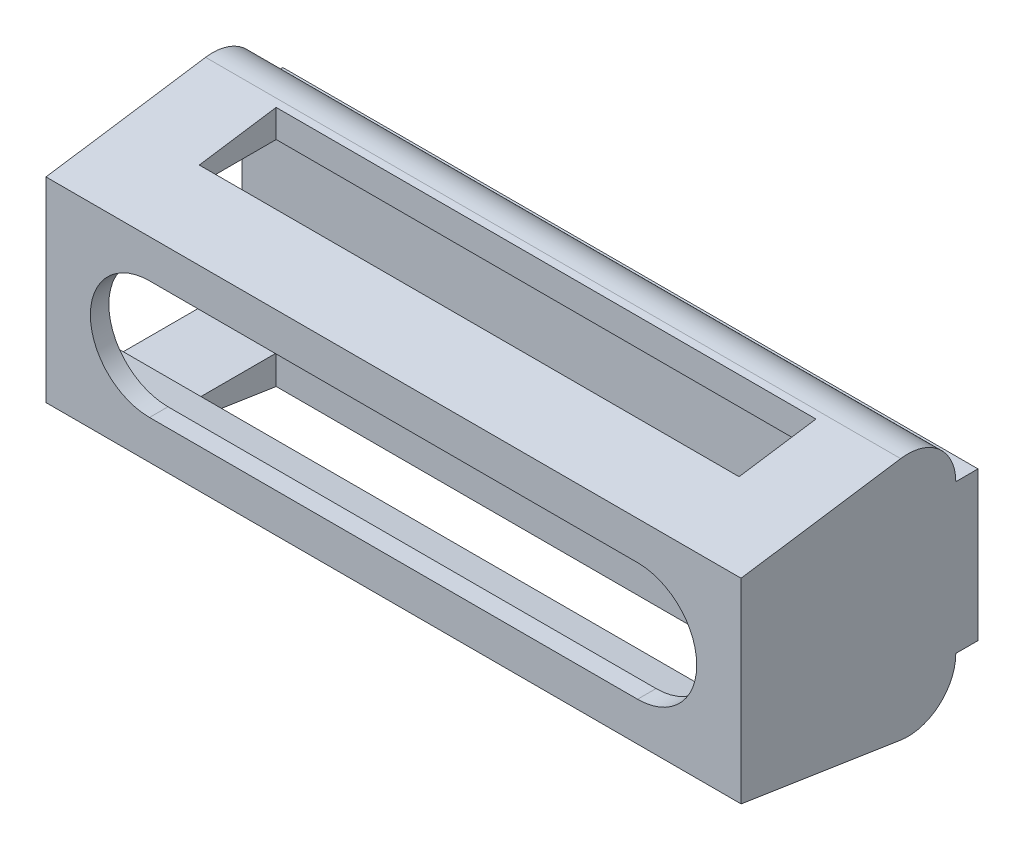
ISO-10303-21;
HEADER;
FILE_DESCRIPTION(('STEP AP214'),'2;1');
FILE_NAME('part.step','',(''),(''),'','','');
FILE_SCHEMA(('AUTOMOTIVE_DESIGN { 1 0 10303 214 1 1 1 1 }'));
ENDSEC;
DATA;
#1=APPLICATION_CONTEXT('core data for automotive mechanical design processes');
#2=APPLICATION_PROTOCOL_DEFINITION('international standard','automotive_design',2000,#1);
#3=PRODUCT_CONTEXT('',#1,'mechanical');
#4=PRODUCT('Part','Part','',(#3));
#5=PRODUCT_RELATED_PRODUCT_CATEGORY('part','',(#4));
#6=PRODUCT_DEFINITION_FORMATION('','',#4);
#7=PRODUCT_DEFINITION_CONTEXT('part definition',#1,'design');
#8=PRODUCT_DEFINITION('design','',#6,#7);
#9=PRODUCT_DEFINITION_SHAPE('','',#8);
#10=(LENGTH_UNIT() NAMED_UNIT(*) SI_UNIT(.MILLI.,.METRE.));
#11=(NAMED_UNIT(*) PLANE_ANGLE_UNIT() SI_UNIT($,.RADIAN.));
#12=(NAMED_UNIT(*) SI_UNIT($,.STERADIAN.) SOLID_ANGLE_UNIT());
#13=UNCERTAINTY_MEASURE_WITH_UNIT(LENGTH_MEASURE(1.E-05),#10,'distance_accuracy_value','');
#14=(GEOMETRIC_REPRESENTATION_CONTEXT(3) GLOBAL_UNCERTAINTY_ASSIGNED_CONTEXT((#13)) GLOBAL_UNIT_ASSIGNED_CONTEXT((#10,
#11,#12)) REPRESENTATION_CONTEXT('',''));
#15=CARTESIAN_POINT('',(0.,0.,0.));
#16=DIRECTION('',(0.,0.,1.));
#17=DIRECTION('',(1.,0.,0.));
#18=AXIS2_PLACEMENT_3D('',#15,#16,#17);
#19=CARTESIAN_POINT('',(-47.,-10.1056842032967,3.99999999999999));
#20=DIRECTION('',(1.,0.,0.));
#21=DIRECTION('',(0.,0.,-1.));
#22=AXIS2_PLACEMENT_3D('',#19,#20,#21);
#23=PLANE('',#22);
#24=DIRECTION('',(0.,-1.,0.));
#25=VECTOR('',#24,1.);
#26=CARTESIAN_POINT('',(-47.,13.222085073651,26.53878381352));
#27=LINE('',#26,#25);
#28=CARTESIAN_POINT('',(-47.,13.222085073651,26.53878381352));
#29=VERTEX_POINT('',#28);
#30=CARTESIAN_POINT('',(-47.,-13.211554854265,26.53878381352));
#31=VERTEX_POINT('',#30);
#32=EDGE_CURVE('E531',#29,#31,#27,.T.);
#33=ORIENTED_EDGE('',*,*,#32,.F.);
#34=DIRECTION('',(0.,0.147470072152151,-0.989066518399768));
#35=VECTOR('',#34,1.);
#36=CARTESIAN_POINT('',(-47.,13.222085073651,26.53878381352));
#37=LINE('',#36,#35);
#38=CARTESIAN_POINT('',(-47.,16.4397026674371,4.95855546898898));
#39=VERTEX_POINT('',#38);
#40=EDGE_CURVE('E546',#29,#39,#37,.T.);
#41=ORIENTED_EDGE('',*,*,#40,.T.);
#42=CARTESIAN_POINT('',(-47.,10.0107702978386,4.));
#43=DIRECTION('',(1.,0.,0.));
#44=DIRECTION('',(0.,0.,-1.));
#45=AXIS2_PLACEMENT_3D('',#42,#43,#44);
#46=CIRCLE('',#45,6.5);
#47=CARTESIAN_POINT('',(-47.,10.0107702978386,-2.5));
#48=VERTEX_POINT('',#47);
#49=EDGE_CURVE('E542',#48,#39,#46,.T.);
#50=ORIENTED_EDGE('',*,*,#49,.F.);
#51=DIRECTION('',(0.,0.,1.));
#52=VECTOR('',#51,1.);
#53=CARTESIAN_POINT('',(-47.,10.0107702978386,-2.5));
#54=LINE('',#53,#52);
#55=CARTESIAN_POINT('',(-47.,10.0107702978386,-5.5));
#56=VERTEX_POINT('',#55);
#57=EDGE_CURVE('E275',#56,#48,#54,.T.);
#58=ORIENTED_EDGE('',*,*,#57,.F.);
#59=DIRECTION('',(0.,1.,0.));
#60=VECTOR('',#59,1.);
#61=CARTESIAN_POINT('',(-47.,10.0107702978386,-5.5));
#62=LINE('',#61,#60);
#63=CARTESIAN_POINT('',(-47.,-10.1056842032967,-5.5));
#64=VERTEX_POINT('',#63);
#65=EDGE_CURVE('E258',#64,#56,#62,.T.);
#66=ORIENTED_EDGE('',*,*,#65,.F.);
#67=DIRECTION('',(0.,0.,1.));
#68=VECTOR('',#67,1.);
#69=CARTESIAN_POINT('',(-47.,-10.1056842032967,-2.5));
#70=LINE('',#69,#68);
#71=CARTESIAN_POINT('',(-47.,-10.1056842032967,-2.5));
#72=VERTEX_POINT('',#71);
#73=EDGE_CURVE('E272',#64,#72,#70,.T.);
#74=ORIENTED_EDGE('',*,*,#73,.T.);
#75=CARTESIAN_POINT('',(-47.,-10.1056842032967,3.99999999999999));
#76=DIRECTION('',(1.,0.,0.));
#77=DIRECTION('',(0.,0.,-1.));
#78=AXIS2_PLACEMENT_3D('',#75,#76,#77);
#79=CIRCLE('',#78,6.5);
#80=CARTESIAN_POINT('',(-47.,-16.5299614040784,4.98927369696994));
#81=VERTEX_POINT('',#80);
#82=EDGE_CURVE('E539',#81,#72,#79,.T.);
#83=ORIENTED_EDGE('',*,*,#82,.F.);
#84=DIRECTION('',(0.,-0.152195953379992,-0.988350338581798));
#85=VECTOR('',#84,1.);
#86=CARTESIAN_POINT('',(-47.,-13.211554854265,26.53878381352));
#87=LINE('',#86,#85);
#88=EDGE_CURVE('E535',#31,#81,#87,.T.);
#89=ORIENTED_EDGE('',*,*,#88,.F.);
#90=EDGE_LOOP('',(#33,#41,#50,#58,#66,#74,#83,#89));
#91=FACE_BOUND('',#90,.T.);
#92=DIRECTION('',(0.,-1.,0.));
#93=VECTOR('',#92,1.);
#94=CARTESIAN_POINT('',(-47.,-10.4640815672427,18.09878381352));
#95=LINE('',#94,#93);
#96=CARTESIAN_POINT('',(-47.,-10.4640815672427,18.09878381352));
#97=VERTEX_POINT('',#96);
#98=CARTESIAN_POINT('',(-47.,-12.4740815672427,18.09878381352));
#99=VERTEX_POINT('',#98);
#100=EDGE_CURVE('E336',#97,#99,#95,.T.);
#101=ORIENTED_EDGE('',*,*,#100,.T.);
#102=DIRECTION('',(0.,0.,-1.));
#103=VECTOR('',#102,1.);
#104=CARTESIAN_POINT('',(-47.,-12.4740815672427,18.09878381352));
#105=LINE('',#104,#103);
#106=CARTESIAN_POINT('',(-47.,-12.4740815672428,5.04597829253834));
#107=VERTEX_POINT('',#106);
#108=EDGE_CURVE('E300',#99,#107,#105,.T.);
#109=ORIENTED_EDGE('',*,*,#108,.T.);
#110=DIRECTION('',(0.,-0.152195953379992,-0.988350338581798));
#111=VECTOR('',#110,1.);
#112=CARTESIAN_POINT('',(-47.,-9.54938165994633,24.03878381352));
#113=LINE('',#112,#111);
#114=CARTESIAN_POINT('',(-47.,-12.5414050940826,4.60878381351997));
#115=VERTEX_POINT('',#114);
#116=EDGE_CURVE('E452',#107,#115,#113,.T.);
#117=ORIENTED_EDGE('',*,*,#116,.T.);
#118=CARTESIAN_POINT('',(-47.,-8.5880037397554,4.));
#119=DIRECTION('',(1.,0.,0.));
#120=DIRECTION('',(0.,0.,-1.));
#121=AXIS2_PLACEMENT_3D('',#118,#119,#120);
#122=CIRCLE('',#121,4.);
#123=CARTESIAN_POINT('',(-47.,-8.5880037397554,0.));
#124=VERTEX_POINT('',#123);
#125=EDGE_CURVE('E458',#115,#124,#122,.T.);
#126=ORIENTED_EDGE('',*,*,#125,.T.);
#127=DIRECTION('',(0.,1.,0.));
#128=VECTOR('',#127,1.);
#129=CARTESIAN_POINT('',(-47.,8.5880037397554,0.));
#130=LINE('',#129,#128);
#131=CARTESIAN_POINT('',(-47.,8.5880037397554,0.));
#132=VERTEX_POINT('',#131);
#133=EDGE_CURVE('E462',#124,#132,#130,.T.);
#134=ORIENTED_EDGE('',*,*,#133,.T.);
#135=CARTESIAN_POINT('',(-47.,8.49435226645461,3.99890352491137));
#136=DIRECTION('',(1.,0.,0.));
#137=DIRECTION('',(0.,0.,-1.));
#138=AXIS2_PLACEMENT_3D('',#135,#136,#137);
#139=CIRCLE('',#138,4.);
#140=CARTESIAN_POINT('',(-47.,12.4807708286558,3.6695601677023));
#141=VERTEX_POINT('',#140);
#142=EDGE_CURVE('E466',#132,#141,#139,.T.);
#143=ORIENTED_EDGE('',*,*,#142,.T.);
#144=DIRECTION('',(0.,0.999998665016465,0.00163400284240014));
#145=VECTOR('',#144,1.);
#146=CARTESIAN_POINT('',(-47.,12.536273867046,3.66965085994587));
#147=LINE('',#146,#145);
#148=CARTESIAN_POINT('',(-47.,12.536273867046,3.66965085994587));
#149=VERTEX_POINT('',#148);
#150=EDGE_CURVE('E304',#141,#149,#147,.T.);
#151=ORIENTED_EDGE('',*,*,#150,.T.);
#152=DIRECTION('',(0.,0.,1.));
#153=VECTOR('',#152,1.);
#154=CARTESIAN_POINT('',(-47.,12.536273867046,18.09878381352));
#155=LINE('',#154,#153);
#156=CARTESIAN_POINT('',(-47.,12.536273867046,18.0987838135201));
#157=VERTEX_POINT('',#156);
#158=EDGE_CURVE('E309',#149,#157,#155,.T.);
#159=ORIENTED_EDGE('',*,*,#158,.T.);
#160=CARTESIAN_POINT('',(-47.,10.436273867046,18.09878381352));
#161=VERTEX_POINT('',#160);
#162=EDGE_CURVE('E305',#157,#161,#95,.T.);
#163=ORIENTED_EDGE('',*,*,#162,.T.);
#164=DIRECTION('',(0.,-0.147470072152151,0.989066518399768));
#165=VECTOR('',#164,1.);
#166=CARTESIAN_POINT('',(-47.,9.55061834005368,24.03878381352));
#167=LINE('',#166,#165);
#168=CARTESIAN_POINT('',(-47.,9.55061834005368,24.03878381352));
#169=VERTEX_POINT('',#168);
#170=EDGE_CURVE('E470',#161,#169,#167,.T.);
#171=ORIENTED_EDGE('',*,*,#170,.T.);
#172=DIRECTION('',(0.,-1.,0.));
#173=VECTOR('',#172,1.);
#174=CARTESIAN_POINT('',(-47.,9.55061834005368,24.03878381352));
#175=LINE('',#174,#173);
#176=CARTESIAN_POINT('',(-47.,-9.54938165994633,24.03878381352));
#177=VERTEX_POINT('',#176);
#178=EDGE_CURVE('E448',#169,#177,#175,.T.);
#179=ORIENTED_EDGE('',*,*,#178,.T.);
#180=EDGE_CURVE('E454',#177,#97,#113,.T.);
#181=ORIENTED_EDGE('',*,*,#180,.T.);
#182=EDGE_LOOP('',(#101,#109,#117,#126,#134,#143,#151,#159,#163,#171,#179,#181));
#183=FACE_BOUND('',#182,.T.);
#184=ADVANCED_FACE('F44',(#91,#183),#23,.F.);
#185=CARTESIAN_POINT('',(46.,-9.54938165994633,24.03878381352));
#186=DIRECTION('',(0.,0.988350338581798,-0.152195953379992));
#187=DIRECTION('',(0.,0.152195953379992,0.988350338581798));
#188=AXIS2_PLACEMENT_3D('',#185,#186,#187);
#189=PLANE('',#188);
#190=DIRECTION('',(0.,-0.152195953379992,-0.988350338581798));
#191=VECTOR('',#190,1.);
#192=CARTESIAN_POINT('',(46.,-9.54938165994633,24.03878381352));
#193=LINE('',#192,#191);
#194=CARTESIAN_POINT('',(46.,-9.54938165994633,24.03878381352));
#195=VERTEX_POINT('',#194);
#196=CARTESIAN_POINT('',(46.,-10.4640815672427,18.09878381352));
#197=VERTEX_POINT('',#196);
#198=EDGE_CURVE('E478',#195,#197,#193,.T.);
#199=ORIENTED_EDGE('',*,*,#198,.T.);
#200=DIRECTION('',(-1.,0.,0.));
#201=VECTOR('',#200,1.);
#202=CARTESIAN_POINT('',(46.,-10.4640815672427,18.09878381352));
#203=LINE('',#202,#201);
#204=EDGE_CURVE('E367',#197,#97,#203,.T.);
#205=ORIENTED_EDGE('',*,*,#204,.T.);
#206=ORIENTED_EDGE('',*,*,#180,.F.);
#207=DIRECTION('',(-1.,0.,0.));
#208=VECTOR('',#207,1.);
#209=CARTESIAN_POINT('',(46.,-9.54938165994633,24.03878381352));
#210=LINE('',#209,#208);
#211=EDGE_CURVE('E509',#195,#177,#210,.T.);
#212=ORIENTED_EDGE('',*,*,#211,.F.);
#213=EDGE_LOOP('',(#199,#205,#206,#212));
#214=FACE_BOUND('',#213,.T.);
#215=ADVANCED_FACE('F663',(#214),#189,.T.);
#216=ORIENTED_EDGE('',*,*,#116,.F.);
#217=DIRECTION('',(1.,0.,0.));
#218=VECTOR('',#217,1.);
#219=CARTESIAN_POINT('',(46.,-12.4740815672427,5.04597829253841));
#220=LINE('',#219,#218);
#221=CARTESIAN_POINT('',(46.,-12.4740815672428,5.04597829253837));
#222=VERTEX_POINT('',#221);
#223=EDGE_CURVE('E348',#107,#222,#220,.T.);
#224=ORIENTED_EDGE('',*,*,#223,.T.);
#225=CARTESIAN_POINT('',(46.,-12.5414050940826,4.60878381351997));
#226=VERTEX_POINT('',#225);
#227=EDGE_CURVE('E477',#222,#226,#193,.T.);
#228=ORIENTED_EDGE('',*,*,#227,.T.);
#229=DIRECTION('',(-1.,0.,0.));
#230=VECTOR('',#229,1.);
#231=CARTESIAN_POINT('',(46.,-12.5414050940826,4.60878381351997));
#232=LINE('',#231,#230);
#233=EDGE_CURVE('E505',#226,#115,#232,.T.);
#234=ORIENTED_EDGE('',*,*,#233,.T.);
#235=EDGE_LOOP('',(#216,#224,#228,#234));
#236=FACE_BOUND('',#235,.T.);
#237=ADVANCED_FACE('F632',(#236),#189,.T.);
#238=CARTESIAN_POINT('',(46.,8.49435226645461,3.99890352491137));
#239=DIRECTION('',(-1.,0.,0.));
#240=DIRECTION('',(0.,0.,1.));
#241=AXIS2_PLACEMENT_3D('',#238,#239,#240);
#242=CYLINDRICAL_SURFACE('',#241,4.);
#243=CARTESIAN_POINT('',(46.,8.49435226645461,3.99890352491137));
#244=DIRECTION('',(1.,0.,0.));
#245=DIRECTION('',(0.,0.,-1.));
#246=AXIS2_PLACEMENT_3D('',#243,#244,#245);
#247=CIRCLE('',#246,4.);
#248=CARTESIAN_POINT('',(46.,8.5880037397554,0.));
#249=VERTEX_POINT('',#248);
#250=CARTESIAN_POINT('',(46.,12.4807708286558,3.6695601677023));
#251=VERTEX_POINT('',#250);
#252=EDGE_CURVE('E488',#249,#251,#247,.T.);
#253=ORIENTED_EDGE('',*,*,#252,.T.);
#254=DIRECTION('',(-1.,0.,0.));
#255=VECTOR('',#254,1.);
#256=CARTESIAN_POINT('',(46.,12.4807708286558,3.6695601677023));
#257=LINE('',#256,#255);
#258=EDGE_CURVE('E360',#251,#141,#257,.T.);
#259=ORIENTED_EDGE('',*,*,#258,.T.);
#260=ORIENTED_EDGE('',*,*,#142,.F.);
#261=DIRECTION('',(-1.,0.,0.));
#262=VECTOR('',#261,1.);
#263=CARTESIAN_POINT('',(46.,8.5880037397554,0.));
#264=LINE('',#263,#262);
#265=EDGE_CURVE('E499',#249,#132,#264,.T.);
#266=ORIENTED_EDGE('',*,*,#265,.F.);
#267=EDGE_LOOP('',(#253,#259,#260,#266));
#268=FACE_BOUND('',#267,.T.);
#269=ADVANCED_FACE('F619',(#268),#242,.F.);
#270=CARTESIAN_POINT('',(46.,9.55061834005368,24.03878381352));
#271=DIRECTION('',(0.,-0.989066518399769,-0.147470072152151));
#272=DIRECTION('',(0.,0.147470072152151,-0.989066518399769));
#273=AXIS2_PLACEMENT_3D('',#270,#271,#272);
#274=PLANE('',#273);
#275=ORIENTED_EDGE('',*,*,#170,.F.);
#276=DIRECTION('',(1.,0.,0.));
#277=VECTOR('',#276,1.);
#278=CARTESIAN_POINT('',(46.,10.436273867046,18.09878381352));
#279=LINE('',#278,#277);
#280=CARTESIAN_POINT('',(46.,10.436273867046,18.09878381352));
#281=VERTEX_POINT('',#280);
#282=EDGE_CURVE('E364',#161,#281,#279,.T.);
#283=ORIENTED_EDGE('',*,*,#282,.T.);
#284=DIRECTION('',(0.,-0.147470072152151,0.989066518399768));
#285=VECTOR('',#284,1.);
#286=CARTESIAN_POINT('',(46.,9.55061834005368,24.03878381352));
#287=LINE('',#286,#285);
#288=CARTESIAN_POINT('',(46.,9.55061834005368,24.03878381352));
#289=VERTEX_POINT('',#288);
#290=EDGE_CURVE('E492',#281,#289,#287,.T.);
#291=ORIENTED_EDGE('',*,*,#290,.T.);
#292=DIRECTION('',(-1.,0.,0.));
#293=VECTOR('',#292,1.);
#294=CARTESIAN_POINT('',(46.,9.55061834005368,24.03878381352));
#295=LINE('',#294,#293);
#296=EDGE_CURVE('E495',#289,#169,#295,.T.);
#297=ORIENTED_EDGE('',*,*,#296,.T.);
#298=EDGE_LOOP('',(#275,#283,#291,#297));
#299=FACE_BOUND('',#298,.T.);
#300=ADVANCED_FACE('F740',(#299),#274,.T.);
#301=CARTESIAN_POINT('',(-36.5,-16.6056842032967,16.30878381352));
#302=DIRECTION('',(0.,0.,1.));
#303=DIRECTION('',(1.,0.,0.));
#304=AXIS2_PLACEMENT_3D('',#301,#302,#303);
#305=PLANE('',#304);
#306=DIRECTION('',(1.,0.,0.));
#307=VECTOR('',#306,1.);
#308=CARTESIAN_POINT('',(-36.5,12.536273867046,16.30878381352));
#309=LINE('',#308,#307);
#310=CARTESIAN_POINT('',(-36.5,12.536273867046,16.30878381352));
#311=VERTEX_POINT('',#310);
#312=CARTESIAN_POINT('',(36.5,12.536273867046,16.30878381352));
#313=VERTEX_POINT('',#312);
#314=EDGE_CURVE('E357',#311,#313,#309,.T.);
#315=ORIENTED_EDGE('',*,*,#314,.F.);
#316=DIRECTION('',(0.,1.,0.));
#317=VECTOR('',#316,1.);
#318=CARTESIAN_POINT('',(-36.5,-16.6056842032967,16.30878381352));
#319=LINE('',#318,#317);
#320=CARTESIAN_POINT('',(-36.5,14.747380703471,16.30878381352));
#321=VERTEX_POINT('',#320);
#322=EDGE_CURVE('E371',#311,#321,#319,.T.);
#323=ORIENTED_EDGE('',*,*,#322,.T.);
#324=DIRECTION('',(-1.,0.,0.));
#325=VECTOR('',#324,1.);
#326=CARTESIAN_POINT('',(-47.,14.747380703471,16.30878381352));
#327=LINE('',#326,#325);
#328=CARTESIAN_POINT('',(36.5,14.747380703471,16.30878381352));
#329=VERTEX_POINT('',#328);
#330=EDGE_CURVE('E390',#329,#321,#327,.T.);
#331=ORIENTED_EDGE('',*,*,#330,.F.);
#332=DIRECTION('',(0.,1.,0.));
#333=VECTOR('',#332,1.);
#334=CARTESIAN_POINT('',(36.5,-16.6056842032967,16.30878381352));
#335=LINE('',#334,#333);
#336=EDGE_CURVE('E381',#313,#329,#335,.T.);
#337=ORIENTED_EDGE('',*,*,#336,.F.);
#338=EDGE_LOOP('',(#315,#323,#331,#337));
#339=FACE_BOUND('',#338,.T.);
#340=ADVANCED_FACE('F742',(#339),#305,.F.);
#341=CARTESIAN_POINT('',(36.5,-16.6056842032967,16.30878381352));
#342=DIRECTION('',(1.,0.,0.));
#343=DIRECTION('',(0.,0.,-1.));
#344=AXIS2_PLACEMENT_3D('',#341,#342,#343);
#345=PLANE('',#344);
#346=DIRECTION('',(0.,0.,-1.));
#347=VECTOR('',#346,1.);
#348=CARTESIAN_POINT('',(36.5,12.536273867046,16.30878381352));
#349=LINE('',#348,#347);
#350=CARTESIAN_POINT('',(36.5,12.536273867046,5.90878381351997));
#351=VERTEX_POINT('',#350);
#352=EDGE_CURVE('E354',#313,#351,#349,.T.);
#353=ORIENTED_EDGE('',*,*,#352,.F.);
#354=ORIENTED_EDGE('',*,*,#336,.T.);
#355=DIRECTION('',(0.,-0.147470072152151,0.989066518399768));
#356=VECTOR('',#355,1.);
#357=CARTESIAN_POINT('',(36.5,13.222085073651,26.53878381352));
#358=LINE('',#357,#356);
#359=CARTESIAN_POINT('',(36.5,16.2980233769928,5.90878381351997));
#360=VERTEX_POINT('',#359);
#361=EDGE_CURVE('E398',#360,#329,#358,.T.);
#362=ORIENTED_EDGE('',*,*,#361,.F.);
#363=DIRECTION('',(0.,1.,0.));
#364=VECTOR('',#363,1.);
#365=CARTESIAN_POINT('',(36.5,-16.6056842032967,5.90878381351997));
#366=LINE('',#365,#364);
#367=EDGE_CURVE('E377',#351,#360,#366,.T.);
#368=ORIENTED_EDGE('',*,*,#367,.F.);
#369=EDGE_LOOP('',(#353,#354,#362,#368));
#370=FACE_BOUND('',#369,.T.);
#371=ADVANCED_FACE('F656',(#370),#345,.F.);
#372=CARTESIAN_POINT('',(-36.5,-16.6056842032967,5.90878381351997));
#373=DIRECTION('',(0.,0.,-1.));
#374=DIRECTION('',(-1.,0.,0.));
#375=AXIS2_PLACEMENT_3D('',#372,#373,#374);
#376=PLANE('',#375);
#377=DIRECTION('',(-1.,0.,0.));
#378=VECTOR('',#377,1.);
#379=CARTESIAN_POINT('',(-36.5,12.536273867046,5.90878381351997));
#380=LINE('',#379,#378);
#381=CARTESIAN_POINT('',(-36.5,12.536273867046,5.90878381351997));
#382=VERTEX_POINT('',#381);
#383=EDGE_CURVE('E351',#351,#382,#380,.T.);
#384=ORIENTED_EDGE('',*,*,#383,.F.);
#385=ORIENTED_EDGE('',*,*,#367,.T.);
#386=DIRECTION('',(1.,0.,0.));
#387=VECTOR('',#386,1.);
#388=CARTESIAN_POINT('',(-47.,16.2980233769929,5.90878381351997));
#389=LINE('',#388,#387);
#390=CARTESIAN_POINT('',(-36.5,16.2980233769929,5.90878381351997));
#391=VERTEX_POINT('',#390);
#392=EDGE_CURVE('E405',#391,#360,#389,.T.);
#393=ORIENTED_EDGE('',*,*,#392,.F.);
#394=DIRECTION('',(0.,1.,0.));
#395=VECTOR('',#394,1.);
#396=CARTESIAN_POINT('',(-36.5,-16.6056842032967,5.90878381351997));
#397=LINE('',#396,#395);
#398=EDGE_CURVE('E372',#382,#391,#397,.T.);
#399=ORIENTED_EDGE('',*,*,#398,.F.);
#400=EDGE_LOOP('',(#384,#385,#393,#399));
#401=FACE_BOUND('',#400,.T.);
#402=ADVANCED_FACE('F650',(#401),#376,.F.);
#403=CARTESIAN_POINT('',(-36.5,-16.6056842032967,16.30878381352));
#404=DIRECTION('',(-1.,0.,0.));
#405=DIRECTION('',(0.,0.,1.));
#406=AXIS2_PLACEMENT_3D('',#403,#404,#405);
#407=PLANE('',#406);
#408=DIRECTION('',(0.,0.,1.));
#409=VECTOR('',#408,1.);
#410=CARTESIAN_POINT('',(-36.5,12.536273867046,16.30878381352));
#411=LINE('',#410,#409);
#412=EDGE_CURVE('E11',#382,#311,#411,.T.);
#413=ORIENTED_EDGE('',*,*,#412,.F.);
#414=ORIENTED_EDGE('',*,*,#398,.T.);
#415=DIRECTION('',(0.,0.147470072152151,-0.989066518399768));
#416=VECTOR('',#415,1.);
#417=CARTESIAN_POINT('',(-36.5,13.222085073651,26.53878381352));
#418=LINE('',#417,#416);
#419=EDGE_CURVE('E412',#321,#391,#418,.T.);
#420=ORIENTED_EDGE('',*,*,#419,.F.);
#421=ORIENTED_EDGE('',*,*,#322,.F.);
#422=EDGE_LOOP('',(#413,#414,#420,#421));
#423=FACE_BOUND('',#422,.T.);
#424=ADVANCED_FACE('F657',(#423),#407,.F.);
#425=DIRECTION('',(0.,0.,-1.));
#426=VECTOR('',#425,1.);
#427=CARTESIAN_POINT('',(-36.5,-12.4740815672427,16.30878381352));
#428=LINE('',#427,#426);
#429=CARTESIAN_POINT('',(-36.5,-12.4740815672427,16.30878381352));
#430=VERTEX_POINT('',#429);
#431=CARTESIAN_POINT('',(-36.5,-12.4740815672427,5.90878381351997));
#432=VERTEX_POINT('',#431);
#433=EDGE_CURVE('E345',#430,#432,#428,.T.);
#434=ORIENTED_EDGE('',*,*,#433,.F.);
#435=CARTESIAN_POINT('',(-36.5,-14.7868713612755,16.30878381352));
#436=VERTEX_POINT('',#435);
#437=EDGE_CURVE('E384',#436,#430,#319,.T.);
#438=ORIENTED_EDGE('',*,*,#437,.F.);
#439=DIRECTION('',(0.,-0.152195953379992,-0.988350338581798));
#440=VECTOR('',#439,1.);
#441=CARTESIAN_POINT('',(-36.5,-13.211554854265,26.53878381352));
#442=LINE('',#441,#440);
#443=CARTESIAN_POINT('',(-36.5,-16.3883661484611,5.90878381351997));
#444=VERTEX_POINT('',#443);
#445=EDGE_CURVE('E409',#436,#444,#442,.T.);
#446=ORIENTED_EDGE('',*,*,#445,.T.);
#447=EDGE_CURVE('E375',#444,#432,#397,.T.);
#448=ORIENTED_EDGE('',*,*,#447,.T.);
#449=EDGE_LOOP('',(#434,#438,#446,#448));
#450=FACE_BOUND('',#449,.T.);
#451=ADVANCED_FACE('F590',(#450),#407,.F.);
#452=DIRECTION('',(1.,0.,0.));
#453=VECTOR('',#452,1.);
#454=CARTESIAN_POINT('',(-36.5,-12.4740815672427,5.90878381351997));
#455=LINE('',#454,#453);
#456=CARTESIAN_POINT('',(36.5,-12.4740815672427,5.90878381351997));
#457=VERTEX_POINT('',#456);
#458=EDGE_CURVE('E342',#432,#457,#455,.T.);
#459=ORIENTED_EDGE('',*,*,#458,.F.);
#460=ORIENTED_EDGE('',*,*,#447,.F.);
#461=DIRECTION('',(1.,0.,0.));
#462=VECTOR('',#461,1.);
#463=CARTESIAN_POINT('',(-47.,-16.3883661484611,5.90878381351997));
#464=LINE('',#463,#462);
#465=CARTESIAN_POINT('',(36.5,-16.3883661484611,5.90878381351996));
#466=VERTEX_POINT('',#465);
#467=EDGE_CURVE('E402',#444,#466,#464,.T.);
#468=ORIENTED_EDGE('',*,*,#467,.T.);
#469=EDGE_CURVE('E376',#466,#457,#366,.T.);
#470=ORIENTED_EDGE('',*,*,#469,.T.);
#471=EDGE_LOOP('',(#459,#460,#468,#470));
#472=FACE_BOUND('',#471,.T.);
#473=ADVANCED_FACE('F647',(#472),#376,.F.);
#474=DIRECTION('',(0.,0.,1.));
#475=VECTOR('',#474,1.);
#476=CARTESIAN_POINT('',(36.5,-12.4740815672427,16.30878381352));
#477=LINE('',#476,#475);
#478=CARTESIAN_POINT('',(36.5,-12.4740815672427,16.30878381352));
#479=VERTEX_POINT('',#478);
#480=EDGE_CURVE('E313',#457,#479,#477,.T.);
#481=ORIENTED_EDGE('',*,*,#480,.F.);
#482=ORIENTED_EDGE('',*,*,#469,.F.);
#483=DIRECTION('',(0.,0.152195953379992,0.988350338581798));
#484=VECTOR('',#483,1.);
#485=CARTESIAN_POINT('',(36.5,-13.211554854265,26.53878381352));
#486=LINE('',#485,#484);
#487=CARTESIAN_POINT('',(36.5,-14.7868713612755,16.30878381352));
#488=VERTEX_POINT('',#487);
#489=EDGE_CURVE('E394',#466,#488,#486,.T.);
#490=ORIENTED_EDGE('',*,*,#489,.T.);
#491=EDGE_CURVE('E380',#488,#479,#335,.T.);
#492=ORIENTED_EDGE('',*,*,#491,.T.);
#493=EDGE_LOOP('',(#481,#482,#490,#492));
#494=FACE_BOUND('',#493,.T.);
#495=ADVANCED_FACE('F639',(#494),#345,.F.);
#496=DIRECTION('',(-1.,0.,0.));
#497=VECTOR('',#496,1.);
#498=CARTESIAN_POINT('',(-36.5,-12.4740815672427,16.30878381352));
#499=LINE('',#498,#497);
#500=EDGE_CURVE('E53',#479,#430,#499,.T.);
#501=ORIENTED_EDGE('',*,*,#500,.F.);
#502=ORIENTED_EDGE('',*,*,#491,.F.);
#503=DIRECTION('',(-1.,0.,0.));
#504=VECTOR('',#503,1.);
#505=CARTESIAN_POINT('',(-47.,-14.7868713612755,16.30878381352));
#506=LINE('',#505,#504);
#507=EDGE_CURVE('E387',#488,#436,#506,.T.);
#508=ORIENTED_EDGE('',*,*,#507,.T.);
#509=ORIENTED_EDGE('',*,*,#437,.T.);
#510=EDGE_LOOP('',(#501,#502,#508,#509));
#511=FACE_BOUND('',#510,.T.);
#512=ADVANCED_FACE('F593',(#511),#305,.F.);
#513=CARTESIAN_POINT('',(-47.,13.222085073651,26.53878381352));
#514=DIRECTION('',(0.,0.,1.));
#515=DIRECTION('',(1.,0.,0.));
#516=AXIS2_PLACEMENT_3D('',#513,#514,#515);
#517=PLANE('',#516);
#518=DIRECTION('',(1.,0.,0.));
#519=VECTOR('',#518,1.);
#520=CARTESIAN_POINT('',(-32.9999611785173,8.05061834005368,26.53878381352));
#521=LINE('',#520,#519);
#522=CARTESIAN_POINT('',(33.0000388214827,8.05061834005368,26.53878381352));
#523=VERTEX_POINT('',#522);
#524=CARTESIAN_POINT('',(-32.9999611785173,8.05061834005368,26.53878381352));
#525=VERTEX_POINT('',#524);
#526=EDGE_CURVE('E453',#523,#525,#521,.F.);
#527=ORIENTED_EDGE('',*,*,#526,.F.);
#528=CARTESIAN_POINT('',(33.0000388214827,0.0506183400536837,26.53878381352));
#529=DIRECTION('',(0.,0.,1.));
#530=DIRECTION('',(1.,0.,0.));
#531=AXIS2_PLACEMENT_3D('',#528,#529,#530);
#532=CIRCLE('',#531,8.);
#533=CARTESIAN_POINT('',(33.0000388214827,-7.94938165994631,26.53878381352));
#534=VERTEX_POINT('',#533);
#535=EDGE_CURVE('E444',#534,#523,#532,.T.);
#536=ORIENTED_EDGE('',*,*,#535,.F.);
#537=DIRECTION('',(1.,0.,0.));
#538=VECTOR('',#537,1.);
#539=CARTESIAN_POINT('',(-32.9999611785173,-7.94938165994631,26.53878381352));
#540=LINE('',#539,#538);
#541=CARTESIAN_POINT('',(-32.9999611785173,-7.94938165994631,26.53878381352));
#542=VERTEX_POINT('',#541);
#543=EDGE_CURVE('E569',#542,#534,#540,.T.);
#544=ORIENTED_EDGE('',*,*,#543,.F.);
#545=CARTESIAN_POINT('',(-32.9999611785173,0.0506183400536837,26.53878381352));
#546=DIRECTION('',(0.,0.,1.));
#547=DIRECTION('',(1.,0.,0.));
#548=AXIS2_PLACEMENT_3D('',#545,#546,#547);
#549=CIRCLE('',#548,8.);
#550=EDGE_CURVE('E573',#525,#542,#549,.T.);
#551=ORIENTED_EDGE('',*,*,#550,.F.);
#552=EDGE_LOOP('',(#527,#536,#544,#551));
#553=FACE_BOUND('',#552,.T.);
#554=DIRECTION('',(1.,0.,0.));
#555=VECTOR('',#554,1.);
#556=CARTESIAN_POINT('',(-47.,-13.211554854265,26.53878381352));
#557=LINE('',#556,#555);
#558=CARTESIAN_POINT('',(47.,-13.211554854265,26.53878381352));
#559=VERTEX_POINT('',#558);
#560=EDGE_CURVE('E549',#31,#559,#557,.T.);
#561=ORIENTED_EDGE('',*,*,#560,.T.);
#562=DIRECTION('',(0.,-1.,0.));
#563=VECTOR('',#562,1.);
#564=CARTESIAN_POINT('',(47.,13.222085073651,26.53878381352));
#565=LINE('',#564,#563);
#566=CARTESIAN_POINT('',(47.,13.222085073651,26.53878381352));
#567=VERTEX_POINT('',#566);
#568=EDGE_CURVE('E512',#567,#559,#565,.T.);
#569=ORIENTED_EDGE('',*,*,#568,.F.);
#570=DIRECTION('',(1.,0.,0.));
#571=VECTOR('',#570,1.);
#572=CARTESIAN_POINT('',(-47.,13.222085073651,26.53878381352));
#573=LINE('',#572,#571);
#574=EDGE_CURVE('E550',#29,#567,#573,.T.);
#575=ORIENTED_EDGE('',*,*,#574,.F.);
#576=ORIENTED_EDGE('',*,*,#32,.T.);
#577=EDGE_LOOP('',(#561,#569,#575,#576));
#578=FACE_BOUND('',#577,.T.);
#579=ADVANCED_FACE('F46',(#553,#578),#517,.T.);
#580=CARTESIAN_POINT('',(-47.,13.222085073651,26.53878381352));
#581=DIRECTION('',(0.,-0.989066518399768,-0.147470072152151));
#582=DIRECTION('',(0.,0.147470072152151,-0.989066518399768));
#583=AXIS2_PLACEMENT_3D('',#580,#581,#582);
#584=PLANE('',#583);
#585=ORIENTED_EDGE('',*,*,#330,.T.);
#586=ORIENTED_EDGE('',*,*,#419,.T.);
#587=ORIENTED_EDGE('',*,*,#392,.T.);
#588=ORIENTED_EDGE('',*,*,#361,.T.);
#589=EDGE_LOOP('',(#585,#586,#587,#588));
#590=FACE_BOUND('',#589,.T.);
#591=ORIENTED_EDGE('',*,*,#574,.T.);
#592=DIRECTION('',(0.,0.147470072152151,-0.989066518399768));
#593=VECTOR('',#592,1.);
#594=CARTESIAN_POINT('',(47.,13.222085073651,26.53878381352));
#595=LINE('',#594,#593);
#596=CARTESIAN_POINT('',(47.,16.4397026674371,4.95855546898898));
#597=VERTEX_POINT('',#596);
#598=EDGE_CURVE('E527',#567,#597,#595,.T.);
#599=ORIENTED_EDGE('',*,*,#598,.T.);
#600=DIRECTION('',(1.,0.,0.));
#601=VECTOR('',#600,1.);
#602=CARTESIAN_POINT('',(-47.,16.4397026674371,4.95855546898898));
#603=LINE('',#602,#601);
#604=EDGE_CURVE('E553',#39,#597,#603,.T.);
#605=ORIENTED_EDGE('',*,*,#604,.F.);
#606=ORIENTED_EDGE('',*,*,#40,.F.);
#607=EDGE_LOOP('',(#591,#599,#605,#606));
#608=FACE_BOUND('',#607,.T.);
#609=ADVANCED_FACE('F676',(#590,#608),#584,.F.);
#610=CARTESIAN_POINT('',(-47.,10.0107702978386,4.));
#611=DIRECTION('',(1.,0.,0.));
#612=DIRECTION('',(0.,0.,-1.));
#613=AXIS2_PLACEMENT_3D('',#610,#611,#612);
#614=CYLINDRICAL_SURFACE('',#613,6.5);
#615=ORIENTED_EDGE('',*,*,#604,.T.);
#616=CARTESIAN_POINT('',(47.,10.0107702978386,4.));
#617=DIRECTION('',(1.,0.,0.));
#618=DIRECTION('',(0.,0.,-1.));
#619=AXIS2_PLACEMENT_3D('',#616,#617,#618);
#620=CIRCLE('',#619,6.5);
#621=CARTESIAN_POINT('',(47.,10.0107702978386,-2.5));
#622=VERTEX_POINT('',#621);
#623=EDGE_CURVE('E523',#622,#597,#620,.T.);
#624=ORIENTED_EDGE('',*,*,#623,.F.);
#625=DIRECTION('',(1.,0.,0.));
#626=VECTOR('',#625,1.);
#627=CARTESIAN_POINT('',(-47.,10.0107702978386,-2.5));
#628=LINE('',#627,#626);
#629=EDGE_CURVE('E556',#48,#622,#628,.T.);
#630=ORIENTED_EDGE('',*,*,#629,.F.);
#631=ORIENTED_EDGE('',*,*,#49,.T.);
#632=EDGE_LOOP('',(#615,#624,#630,#631));
#633=FACE_BOUND('',#632,.T.);
#634=ADVANCED_FACE('F679',(#633),#614,.T.);
#635=CARTESIAN_POINT('',(-47.,-10.1056842032967,3.99999999999999));
#636=DIRECTION('',(1.,0.,0.));
#637=DIRECTION('',(0.,0.,-1.));
#638=AXIS2_PLACEMENT_3D('',#635,#636,#637);
#639=CYLINDRICAL_SURFACE('',#638,6.5);
#640=DIRECTION('',(1.,0.,0.));
#641=VECTOR('',#640,1.);
#642=CARTESIAN_POINT('',(-47.,-10.1056842032967,-2.5));
#643=LINE('',#642,#641);
#644=CARTESIAN_POINT('',(47.,-10.1056842032967,-2.5));
#645=VERTEX_POINT('',#644);
#646=EDGE_CURVE('E282',#72,#645,#643,.T.);
#647=ORIENTED_EDGE('',*,*,#646,.T.);
#648=CARTESIAN_POINT('',(47.,-10.1056842032967,3.99999999999999));
#649=DIRECTION('',(1.,0.,0.));
#650=DIRECTION('',(0.,0.,-1.));
#651=AXIS2_PLACEMENT_3D('',#648,#649,#650);
#652=CIRCLE('',#651,6.5);
#653=CARTESIAN_POINT('',(47.,-16.5299614040784,4.98927369696994));
#654=VERTEX_POINT('',#653);
#655=EDGE_CURVE('E520',#654,#645,#652,.T.);
#656=ORIENTED_EDGE('',*,*,#655,.F.);
#657=DIRECTION('',(1.,0.,0.));
#658=VECTOR('',#657,1.);
#659=CARTESIAN_POINT('',(-47.,-16.5299614040784,4.98927369696994));
#660=LINE('',#659,#658);
#661=EDGE_CURVE('E562',#81,#654,#660,.T.);
#662=ORIENTED_EDGE('',*,*,#661,.F.);
#663=ORIENTED_EDGE('',*,*,#82,.T.);
#664=EDGE_LOOP('',(#647,#656,#662,#663));
#665=FACE_BOUND('',#664,.T.);
#666=ADVANCED_FACE('F682',(#665),#639,.T.);
#667=CARTESIAN_POINT('',(-47.,-13.211554854265,26.53878381352));
#668=DIRECTION('',(0.,-0.988350338581798,0.152195953379992));
#669=DIRECTION('',(0.,-0.152195953379992,-0.988350338581798));
#670=AXIS2_PLACEMENT_3D('',#667,#668,#669);
#671=PLANE('',#670);
#672=ORIENTED_EDGE('',*,*,#445,.F.);
#673=ORIENTED_EDGE('',*,*,#507,.F.);
#674=ORIENTED_EDGE('',*,*,#489,.F.);
#675=ORIENTED_EDGE('',*,*,#467,.F.);
#676=EDGE_LOOP('',(#672,#673,#674,#675));
#677=FACE_BOUND('',#676,.T.);
#678=ORIENTED_EDGE('',*,*,#661,.T.);
#679=DIRECTION('',(0.,-0.152195953379992,-0.988350338581798));
#680=VECTOR('',#679,1.);
#681=CARTESIAN_POINT('',(47.,-13.211554854265,26.53878381352));
#682=LINE('',#681,#680);
#683=EDGE_CURVE('E516',#559,#654,#682,.T.);
#684=ORIENTED_EDGE('',*,*,#683,.F.);
#685=ORIENTED_EDGE('',*,*,#560,.F.);
#686=ORIENTED_EDGE('',*,*,#88,.T.);
#687=EDGE_LOOP('',(#678,#684,#685,#686));
#688=FACE_BOUND('',#687,.T.);
#689=ADVANCED_FACE('F644',(#677,#688),#671,.T.);
#690=CARTESIAN_POINT('',(47.,-10.1056842032967,3.99999999999999));
#691=DIRECTION('',(1.,0.,0.));
#692=DIRECTION('',(0.,0.,-1.));
#693=AXIS2_PLACEMENT_3D('',#690,#691,#692);
#694=PLANE('',#693);
#695=ORIENTED_EDGE('',*,*,#568,.T.);
#696=ORIENTED_EDGE('',*,*,#683,.T.);
#697=ORIENTED_EDGE('',*,*,#655,.T.);
#698=DIRECTION('',(0.,0.,-1.));
#699=VECTOR('',#698,1.);
#700=CARTESIAN_POINT('',(47.,-10.1056842032967,-2.5));
#701=LINE('',#700,#699);
#702=CARTESIAN_POINT('',(47.,-10.1056842032967,-5.5));
#703=VERTEX_POINT('',#702);
#704=EDGE_CURVE('E284',#645,#703,#701,.T.);
#705=ORIENTED_EDGE('',*,*,#704,.T.);
#706=DIRECTION('',(0.,-1.,0.));
#707=VECTOR('',#706,1.);
#708=CARTESIAN_POINT('',(47.,10.0107702978386,-5.5));
#709=LINE('',#708,#707);
#710=CARTESIAN_POINT('',(47.,10.0107702978386,-5.5));
#711=VERTEX_POINT('',#710);
#712=EDGE_CURVE('E259',#711,#703,#709,.T.);
#713=ORIENTED_EDGE('',*,*,#712,.F.);
#714=DIRECTION('',(0.,0.,-1.));
#715=VECTOR('',#714,1.);
#716=CARTESIAN_POINT('',(47.,10.0107702978386,-2.5));
#717=LINE('',#716,#715);
#718=EDGE_CURVE('E288',#622,#711,#717,.T.);
#719=ORIENTED_EDGE('',*,*,#718,.F.);
#720=ORIENTED_EDGE('',*,*,#623,.T.);
#721=ORIENTED_EDGE('',*,*,#598,.F.);
#722=EDGE_LOOP('',(#695,#696,#697,#705,#713,#719,#720,#721));
#723=FACE_BOUND('',#722,.T.);
#724=ADVANCED_FACE('F674',(#723),#694,.T.);
#725=CARTESIAN_POINT('',(46.,9.55061834005368,24.03878381352));
#726=DIRECTION('',(0.,0.,-1.));
#727=DIRECTION('',(-1.,0.,0.));
#728=AXIS2_PLACEMENT_3D('',#725,#726,#727);
#729=PLANE('',#728);
#730=DIRECTION('',(-1.,0.,0.));
#731=VECTOR('',#730,1.);
#732=CARTESIAN_POINT('',(-32.9999611785173,8.05061834005368,24.03878381352));
#733=LINE('',#732,#731);
#734=CARTESIAN_POINT('',(33.0000388214827,8.05061834005368,24.03878381352));
#735=VERTEX_POINT('',#734);
#736=CARTESIAN_POINT('',(-32.9999611785173,8.05061834005368,24.03878381352));
#737=VERTEX_POINT('',#736);
#738=EDGE_CURVE('E416',#735,#737,#733,.T.);
#739=ORIENTED_EDGE('',*,*,#738,.T.);
#740=CARTESIAN_POINT('',(-32.9999611785173,0.0506183400536837,24.03878381352));
#741=DIRECTION('',(0.,0.,-1.));
#742=DIRECTION('',(-1.,0.,0.));
#743=AXIS2_PLACEMENT_3D('',#740,#741,#742);
#744=CIRCLE('',#743,8.);
#745=CARTESIAN_POINT('',(-32.9999611785173,-7.94938165994631,24.03878381352));
#746=VERTEX_POINT('',#745);
#747=EDGE_CURVE('E432',#737,#746,#744,.F.);
#748=ORIENTED_EDGE('',*,*,#747,.T.);
#749=DIRECTION('',(1.,0.,0.));
#750=VECTOR('',#749,1.);
#751=CARTESIAN_POINT('',(-32.9999611785173,-7.94938165994631,24.03878381352));
#752=LINE('',#751,#750);
#753=CARTESIAN_POINT('',(33.0000388214827,-7.94938165994631,24.03878381352));
#754=VERTEX_POINT('',#753);
#755=EDGE_CURVE('E427',#746,#754,#752,.T.);
#756=ORIENTED_EDGE('',*,*,#755,.T.);
#757=CARTESIAN_POINT('',(33.0000388214827,0.0506183400536837,24.03878381352));
#758=DIRECTION('',(0.,0.,-1.));
#759=DIRECTION('',(-1.,0.,0.));
#760=AXIS2_PLACEMENT_3D('',#757,#758,#759);
#761=CIRCLE('',#760,8.);
#762=EDGE_CURVE('E421',#754,#735,#761,.F.);
#763=ORIENTED_EDGE('',*,*,#762,.T.);
#764=EDGE_LOOP('',(#739,#748,#756,#763));
#765=FACE_BOUND('',#764,.T.);
#766=ORIENTED_EDGE('',*,*,#296,.F.);
#767=DIRECTION('',(0.,-1.,0.));
#768=VECTOR('',#767,1.);
#769=CARTESIAN_POINT('',(46.,9.55061834005368,24.03878381352));
#770=LINE('',#769,#768);
#771=EDGE_CURVE('E473',#289,#195,#770,.T.);
#772=ORIENTED_EDGE('',*,*,#771,.T.);
#773=ORIENTED_EDGE('',*,*,#211,.T.);
#774=ORIENTED_EDGE('',*,*,#178,.F.);
#775=EDGE_LOOP('',(#766,#772,#773,#774));
#776=FACE_BOUND('',#775,.T.);
#777=ADVANCED_FACE('F690',(#765,#776),#729,.T.);
#778=CARTESIAN_POINT('',(46.,-8.5880037397554,4.));
#779=DIRECTION('',(-1.,0.,0.));
#780=DIRECTION('',(0.,0.,1.));
#781=AXIS2_PLACEMENT_3D('',#778,#779,#780);
#782=CYLINDRICAL_SURFACE('',#781,4.);
#783=ORIENTED_EDGE('',*,*,#233,.F.);
#784=CARTESIAN_POINT('',(46.,-8.5880037397554,4.));
#785=DIRECTION('',(1.,0.,0.));
#786=DIRECTION('',(0.,0.,-1.));
#787=AXIS2_PLACEMENT_3D('',#784,#785,#786);
#788=CIRCLE('',#787,4.);
#789=CARTESIAN_POINT('',(46.,-8.5880037397554,0.));
#790=VERTEX_POINT('',#789);
#791=EDGE_CURVE('E482',#226,#790,#788,.T.);
#792=ORIENTED_EDGE('',*,*,#791,.T.);
#793=DIRECTION('',(-1.,0.,0.));
#794=VECTOR('',#793,1.);
#795=CARTESIAN_POINT('',(46.,-8.5880037397554,0.));
#796=LINE('',#795,#794);
#797=EDGE_CURVE('E502',#790,#124,#796,.T.);
#798=ORIENTED_EDGE('',*,*,#797,.T.);
#799=ORIENTED_EDGE('',*,*,#125,.F.);
#800=EDGE_LOOP('',(#783,#792,#798,#799));
#801=FACE_BOUND('',#800,.T.);
#802=ADVANCED_FACE('F629',(#801),#782,.F.);
#803=CARTESIAN_POINT('',(46.,8.5880037397554,0.));
#804=DIRECTION('',(0.,0.,1.));
#805=DIRECTION('',(1.,0.,0.));
#806=AXIS2_PLACEMENT_3D('',#803,#804,#805);
#807=PLANE('',#806);
#808=ORIENTED_EDGE('',*,*,#797,.F.);
#809=DIRECTION('',(0.,1.,0.));
#810=VECTOR('',#809,1.);
#811=CARTESIAN_POINT('',(46.,8.5880037397554,0.));
#812=LINE('',#811,#810);
#813=EDGE_CURVE('E485',#790,#249,#812,.T.);
#814=ORIENTED_EDGE('',*,*,#813,.T.);
#815=ORIENTED_EDGE('',*,*,#265,.T.);
#816=ORIENTED_EDGE('',*,*,#133,.F.);
#817=EDGE_LOOP('',(#808,#814,#815,#816));
#818=FACE_BOUND('',#817,.T.);
#819=ADVANCED_FACE('F625',(#818),#807,.T.);
#820=CARTESIAN_POINT('',(46.,-8.5880037397554,4.));
#821=DIRECTION('',(1.,0.,0.));
#822=DIRECTION('',(0.,0.,-1.));
#823=AXIS2_PLACEMENT_3D('',#820,#821,#822);
#824=PLANE('',#823);
#825=ORIENTED_EDGE('',*,*,#227,.F.);
#826=DIRECTION('',(0.,0.,1.));
#827=VECTOR('',#826,1.);
#828=CARTESIAN_POINT('',(46.,-12.4740815672427,18.09878381352));
#829=LINE('',#828,#827);
#830=CARTESIAN_POINT('',(46.,-12.4740815672427,18.09878381352));
#831=VERTEX_POINT('',#830);
#832=EDGE_CURVE('E60',#222,#831,#829,.T.);
#833=ORIENTED_EDGE('',*,*,#832,.T.);
#834=DIRECTION('',(0.,1.,0.));
#835=VECTOR('',#834,1.);
#836=CARTESIAN_POINT('',(46.,-10.4640815672427,18.09878381352));
#837=LINE('',#836,#835);
#838=EDGE_CURVE('E323',#831,#197,#837,.T.);
#839=ORIENTED_EDGE('',*,*,#838,.T.);
#840=ORIENTED_EDGE('',*,*,#198,.F.);
#841=ORIENTED_EDGE('',*,*,#771,.F.);
#842=ORIENTED_EDGE('',*,*,#290,.F.);
#843=CARTESIAN_POINT('',(46.,12.536273867046,18.09878381352));
#844=VERTEX_POINT('',#843);
#845=EDGE_CURVE('E68',#281,#844,#837,.T.);
#846=ORIENTED_EDGE('',*,*,#845,.T.);
#847=DIRECTION('',(0.,0.,-1.));
#848=VECTOR('',#847,1.);
#849=CARTESIAN_POINT('',(46.,12.536273867046,18.09878381352));
#850=LINE('',#849,#848);
#851=CARTESIAN_POINT('',(46.,12.536273867046,3.66965085994587));
#852=VERTEX_POINT('',#851);
#853=EDGE_CURVE('E264',#844,#852,#850,.T.);
#854=ORIENTED_EDGE('',*,*,#853,.T.);
#855=DIRECTION('',(0.,-0.999998665016464,-0.00163400284240014));
#856=VECTOR('',#855,1.);
#857=CARTESIAN_POINT('',(46.,12.536273867046,3.66965085994587));
#858=LINE('',#857,#856);
#859=EDGE_CURVE('E317',#852,#251,#858,.T.);
#860=ORIENTED_EDGE('',*,*,#859,.T.);
#861=ORIENTED_EDGE('',*,*,#252,.F.);
#862=ORIENTED_EDGE('',*,*,#813,.F.);
#863=ORIENTED_EDGE('',*,*,#791,.F.);
#864=EDGE_LOOP('',(#825,#833,#839,#840,#841,#842,#846,#854,#860,#861,#862,#863));
#865=FACE_BOUND('',#864,.T.);
#866=ADVANCED_FACE('F603',(#865),#824,.F.);
#867=CARTESIAN_POINT('',(-32.9999611785173,8.05061834005368,-59.5076104833017));
#868=DIRECTION('',(0.,1.,0.));
#869=DIRECTION('',(0.,0.,1.));
#870=AXIS2_PLACEMENT_3D('',#867,#868,#869);
#871=PLANE('',#870);
#872=ORIENTED_EDGE('',*,*,#526,.T.);
#873=DIRECTION('',(0.,0.,1.));
#874=VECTOR('',#873,1.);
#875=CARTESIAN_POINT('',(-32.9999611785173,8.05061834005368,-59.5076104833017));
#876=LINE('',#875,#874);
#877=EDGE_CURVE('E420',#737,#525,#876,.T.);
#878=ORIENTED_EDGE('',*,*,#877,.F.);
#879=ORIENTED_EDGE('',*,*,#738,.F.);
#880=DIRECTION('',(0.,0.,1.));
#881=VECTOR('',#880,1.);
#882=CARTESIAN_POINT('',(33.0000388214827,8.05061834005368,-59.5076104833017));
#883=LINE('',#882,#881);
#884=EDGE_CURVE('E425',#735,#523,#883,.T.);
#885=ORIENTED_EDGE('',*,*,#884,.T.);
#886=EDGE_LOOP('',(#872,#878,#879,#885));
#887=FACE_BOUND('',#886,.T.);
#888=ADVANCED_FACE('F783',(#887),#871,.F.);
#889=CARTESIAN_POINT('',(-32.9999611785173,0.0506183400536837,-59.5076104833017));
#890=DIRECTION('',(0.,0.,1.));
#891=DIRECTION('',(1.,0.,0.));
#892=AXIS2_PLACEMENT_3D('',#889,#890,#891);
#893=CYLINDRICAL_SURFACE('',#892,8.);
#894=ORIENTED_EDGE('',*,*,#550,.T.);
#895=DIRECTION('',(0.,0.,1.));
#896=VECTOR('',#895,1.);
#897=CARTESIAN_POINT('',(-32.9999611785173,-7.94938165994631,-59.5076104833017));
#898=LINE('',#897,#896);
#899=EDGE_CURVE('E431',#746,#542,#898,.T.);
#900=ORIENTED_EDGE('',*,*,#899,.F.);
#901=ORIENTED_EDGE('',*,*,#747,.F.);
#902=ORIENTED_EDGE('',*,*,#877,.T.);
#903=EDGE_LOOP('',(#894,#900,#901,#902));
#904=FACE_BOUND('',#903,.T.);
#905=ADVANCED_FACE('F787',(#904),#893,.F.);
#906=CARTESIAN_POINT('',(-32.9999611785173,-7.94938165994631,-59.5076104833017));
#907=DIRECTION('',(0.,-1.,0.));
#908=DIRECTION('',(0.,0.,-1.));
#909=AXIS2_PLACEMENT_3D('',#906,#907,#908);
#910=PLANE('',#909);
#911=ORIENTED_EDGE('',*,*,#543,.T.);
#912=DIRECTION('',(0.,0.,1.));
#913=VECTOR('',#912,1.);
#914=CARTESIAN_POINT('',(33.0000388214827,-7.94938165994631,-59.5076104833017));
#915=LINE('',#914,#913);
#916=EDGE_CURVE('E426',#754,#534,#915,.T.);
#917=ORIENTED_EDGE('',*,*,#916,.F.);
#918=ORIENTED_EDGE('',*,*,#755,.F.);
#919=ORIENTED_EDGE('',*,*,#899,.T.);
#920=EDGE_LOOP('',(#911,#917,#918,#919));
#921=FACE_BOUND('',#920,.T.);
#922=ADVANCED_FACE('F795',(#921),#910,.F.);
#923=CARTESIAN_POINT('',(33.0000388214827,0.0506183400536837,-59.5076104833017));
#924=DIRECTION('',(0.,0.,1.));
#925=DIRECTION('',(1.,0.,0.));
#926=AXIS2_PLACEMENT_3D('',#923,#924,#925);
#927=CYLINDRICAL_SURFACE('',#926,8.);
#928=ORIENTED_EDGE('',*,*,#535,.T.);
#929=ORIENTED_EDGE('',*,*,#884,.F.);
#930=ORIENTED_EDGE('',*,*,#762,.F.);
#931=ORIENTED_EDGE('',*,*,#916,.T.);
#932=EDGE_LOOP('',(#928,#929,#930,#931));
#933=FACE_BOUND('',#932,.T.);
#934=ADVANCED_FACE('F723',(#933),#927,.F.);
#935=CARTESIAN_POINT('',(-75.8946150510689,-12.4740815672427,18.09878381352));
#936=DIRECTION('',(0.,1.,0.));
#937=DIRECTION('',(0.,0.,1.));
#938=AXIS2_PLACEMENT_3D('',#935,#936,#937);
#939=PLANE('',#938);
#940=ORIENTED_EDGE('',*,*,#108,.F.);
#941=DIRECTION('',(1.,0.,0.));
#942=VECTOR('',#941,1.);
#943=CARTESIAN_POINT('',(-75.8946150510689,-12.4740815672427,18.09878381352));
#944=LINE('',#943,#942);
#945=EDGE_CURVE('E327',#99,#831,#944,.T.);
#946=ORIENTED_EDGE('',*,*,#945,.T.);
#947=ORIENTED_EDGE('',*,*,#832,.F.);
#948=ORIENTED_EDGE('',*,*,#223,.F.);
#949=EDGE_LOOP('',(#940,#946,#947,#948));
#950=FACE_BOUND('',#949,.T.);
#951=ORIENTED_EDGE('',*,*,#433,.T.);
#952=ORIENTED_EDGE('',*,*,#458,.T.);
#953=ORIENTED_EDGE('',*,*,#480,.T.);
#954=ORIENTED_EDGE('',*,*,#500,.T.);
#955=EDGE_LOOP('',(#951,#952,#953,#954));
#956=FACE_BOUND('',#955,.T.);
#957=ADVANCED_FACE('F581',(#950,#956),#939,.T.);
#958=CARTESIAN_POINT('',(-75.8946150510689,-10.4640815672427,18.09878381352));
#959=DIRECTION('',(0.,0.,-1.));
#960=DIRECTION('',(0.,1.,0.));
#961=AXIS2_PLACEMENT_3D('',#958,#959,#960);
#962=PLANE('',#961);
#963=ORIENTED_EDGE('',*,*,#838,.F.);
#964=ORIENTED_EDGE('',*,*,#945,.F.);
#965=ORIENTED_EDGE('',*,*,#100,.F.);
#966=ORIENTED_EDGE('',*,*,#204,.F.);
#967=EDGE_LOOP('',(#963,#964,#965,#966));
#968=FACE_BOUND('',#967,.T.);
#969=ADVANCED_FACE('F721',(#968),#962,.T.);
#970=CARTESIAN_POINT('',(-75.8946150510689,12.536273867046,18.09878381352));
#971=DIRECTION('',(0.,-1.,0.));
#972=DIRECTION('',(0.,0.,-1.));
#973=AXIS2_PLACEMENT_3D('',#970,#971,#972);
#974=PLANE('',#973);
#975=DIRECTION('',(1.,0.,0.));
#976=VECTOR('',#975,1.);
#977=CARTESIAN_POINT('',(-75.8946150510689,12.536273867046,3.66965085994587));
#978=LINE('',#977,#976);
#979=EDGE_CURVE('E330',#149,#852,#978,.T.);
#980=ORIENTED_EDGE('',*,*,#979,.T.);
#981=ORIENTED_EDGE('',*,*,#853,.F.);
#982=DIRECTION('',(1.,0.,0.));
#983=VECTOR('',#982,1.);
#984=CARTESIAN_POINT('',(-75.8946150510689,12.536273867046,18.09878381352));
#985=LINE('',#984,#983);
#986=EDGE_CURVE('E333',#157,#844,#985,.T.);
#987=ORIENTED_EDGE('',*,*,#986,.F.);
#988=ORIENTED_EDGE('',*,*,#158,.F.);
#989=EDGE_LOOP('',(#980,#981,#987,#988));
#990=FACE_BOUND('',#989,.T.);
#991=ORIENTED_EDGE('',*,*,#314,.T.);
#992=ORIENTED_EDGE('',*,*,#352,.T.);
#993=ORIENTED_EDGE('',*,*,#383,.T.);
#994=ORIENTED_EDGE('',*,*,#412,.T.);
#995=EDGE_LOOP('',(#991,#992,#993,#994));
#996=FACE_BOUND('',#995,.T.);
#997=ADVANCED_FACE('F610',(#990,#996),#974,.T.);
#998=ORIENTED_EDGE('',*,*,#162,.F.);
#999=ORIENTED_EDGE('',*,*,#986,.T.);
#1000=ORIENTED_EDGE('',*,*,#845,.F.);
#1001=ORIENTED_EDGE('',*,*,#282,.F.);
#1002=EDGE_LOOP('',(#998,#999,#1000,#1001));
#1003=FACE_BOUND('',#1002,.T.);
#1004=ADVANCED_FACE('F608',(#1003),#962,.T.);
#1005=CARTESIAN_POINT('',(-75.8946150510689,12.536273867046,3.66965085994587));
#1006=DIRECTION('',(0.,-0.00163400284240014,0.999998665016465));
#1007=DIRECTION('',(0.,-0.999998665016465,-0.00163400284240014));
#1008=AXIS2_PLACEMENT_3D('',#1005,#1006,#1007);
#1009=PLANE('',#1008);
#1010=ORIENTED_EDGE('',*,*,#859,.F.);
#1011=ORIENTED_EDGE('',*,*,#979,.F.);
#1012=ORIENTED_EDGE('',*,*,#150,.F.);
#1013=ORIENTED_EDGE('',*,*,#258,.F.);
#1014=EDGE_LOOP('',(#1010,#1011,#1012,#1013));
#1015=FACE_BOUND('',#1014,.T.);
#1016=ADVANCED_FACE('F614',(#1015),#1009,.T.);
#1017=CARTESIAN_POINT('',(67.338921842031,10.0107702978386,-2.5));
#1018=DIRECTION('',(0.,1.,0.));
#1019=DIRECTION('',(0.,0.,1.));
#1020=AXIS2_PLACEMENT_3D('',#1017,#1018,#1019);
#1021=PLANE('',#1020);
#1022=ORIENTED_EDGE('',*,*,#629,.T.);
#1023=ORIENTED_EDGE('',*,*,#718,.T.);
#1024=DIRECTION('',(-1.,0.,0.));
#1025=VECTOR('',#1024,1.);
#1026=CARTESIAN_POINT('',(67.338921842031,10.0107702978386,-5.5));
#1027=LINE('',#1026,#1025);
#1028=EDGE_CURVE('E294',#711,#56,#1027,.T.);
#1029=ORIENTED_EDGE('',*,*,#1028,.T.);
#1030=ORIENTED_EDGE('',*,*,#57,.T.);
#1031=EDGE_LOOP('',(#1022,#1023,#1029,#1030));
#1032=FACE_BOUND('',#1031,.T.);
#1033=ADVANCED_FACE('F708',(#1032),#1021,.T.);
#1034=CARTESIAN_POINT('',(67.338921842031,10.0107702978386,-5.5));
#1035=DIRECTION('',(0.,0.,-1.));
#1036=DIRECTION('',(0.,1.,0.));
#1037=AXIS2_PLACEMENT_3D('',#1034,#1035,#1036);
#1038=PLANE('',#1037);
#1039=CARTESIAN_POINT('',(24.,0.,-5.5));
#1040=DIRECTION('',(0.,0.,-1.));
#1041=DIRECTION('',(0.,1.,0.));
#1042=AXIS2_PLACEMENT_3D('',#1039,#1040,#1041);
#1043=CIRCLE('',#1042,2.);
#1044=CARTESIAN_POINT('',(24.,2.,-5.5));
#1045=VERTEX_POINT('',#1044);
#1046=EDGE_CURVE('E908',#1045,#1045,#1043,.T.);
#1047=ORIENTED_EDGE('',*,*,#1046,.F.);
#1048=EDGE_LOOP('',(#1047));
#1049=FACE_BOUND('',#1048,.T.);
#1050=CARTESIAN_POINT('',(-24.,0.,-5.5));
#1051=DIRECTION('',(0.,0.,-1.));
#1052=DIRECTION('',(0.,1.,0.));
#1053=AXIS2_PLACEMENT_3D('',#1050,#1051,#1052);
#1054=CIRCLE('',#1053,2.);
#1055=CARTESIAN_POINT('',(-24.,2.,-5.5));
#1056=VERTEX_POINT('',#1055);
#1057=EDGE_CURVE('E912',#1056,#1056,#1054,.T.);
#1058=ORIENTED_EDGE('',*,*,#1057,.F.);
#1059=EDGE_LOOP('',(#1058));
#1060=FACE_BOUND('',#1059,.T.);
#1061=ORIENTED_EDGE('',*,*,#1028,.F.);
#1062=ORIENTED_EDGE('',*,*,#712,.T.);
#1063=DIRECTION('',(-1.,0.,0.));
#1064=VECTOR('',#1063,1.);
#1065=CARTESIAN_POINT('',(67.338921842031,-10.1056842032967,-5.5));
#1066=LINE('',#1065,#1064);
#1067=EDGE_CURVE('E254',#703,#64,#1066,.T.);
#1068=ORIENTED_EDGE('',*,*,#1067,.T.);
#1069=ORIENTED_EDGE('',*,*,#65,.T.);
#1070=EDGE_LOOP('',(#1061,#1062,#1068,#1069));
#1071=FACE_BOUND('',#1070,.T.);
#1072=ADVANCED_FACE('F257',(#1049,#1060,#1071),#1038,.T.);
#1073=CARTESIAN_POINT('',(67.338921842031,-10.1056842032967,-2.5));
#1074=DIRECTION('',(0.,1.,0.));
#1075=DIRECTION('',(0.,0.,1.));
#1076=AXIS2_PLACEMENT_3D('',#1073,#1074,#1075);
#1077=PLANE('',#1076);
#1078=ORIENTED_EDGE('',*,*,#704,.F.);
#1079=ORIENTED_EDGE('',*,*,#646,.F.);
#1080=ORIENTED_EDGE('',*,*,#73,.F.);
#1081=ORIENTED_EDGE('',*,*,#1067,.F.);
#1082=EDGE_LOOP('',(#1078,#1079,#1080,#1081));
#1083=FACE_BOUND('',#1082,.T.);
#1084=ADVANCED_FACE('F280',(#1083),#1077,.F.);
#1085=CARTESIAN_POINT('',(-24.,0.,-1.5));
#1086=DIRECTION('',(0.,0.,-1.));
#1087=DIRECTION('',(0.,1.,0.));
#1088=AXIS2_PLACEMENT_3D('',#1085,#1086,#1087);
#1089=CYLINDRICAL_SURFACE('',#1088,2.);
#1090=CARTESIAN_POINT('',(-24.,0.,-1.5));
#1091=DIRECTION('',(0.,0.,-1.));
#1092=DIRECTION('',(0.,1.,0.));
#1093=AXIS2_PLACEMENT_3D('',#1090,#1091,#1092);
#1094=CIRCLE('',#1093,2.);
#1095=CARTESIAN_POINT('',(-24.,2.,-1.5));
#1096=VERTEX_POINT('',#1095);
#1097=EDGE_CURVE('E918',#1096,#1096,#1094,.T.);
#1098=ORIENTED_EDGE('',*,*,#1097,.F.);
#1099=EDGE_LOOP('',(#1098));
#1100=FACE_BOUND('',#1099,.T.);
#1101=ORIENTED_EDGE('',*,*,#1057,.T.);
#1102=EDGE_LOOP('',(#1101));
#1103=FACE_BOUND('',#1102,.T.);
#1104=ADVANCED_FACE('F865',(#1100,#1103),#1089,.F.);
#1105=CARTESIAN_POINT('',(-24.,0.,-1.5));
#1106=DIRECTION('',(0.,0.,-1.));
#1107=DIRECTION('',(0.,1.,0.));
#1108=AXIS2_PLACEMENT_3D('',#1105,#1106,#1107);
#1109=PLANE('',#1108);
#1110=ORIENTED_EDGE('',*,*,#1097,.T.);
#1111=EDGE_LOOP('',(#1110));
#1112=FACE_BOUND('',#1111,.T.);
#1113=ADVANCED_FACE('F872',(#1112),#1109,.T.);
#1114=CARTESIAN_POINT('',(24.,0.,-1.5));
#1115=DIRECTION('',(0.,0.,-1.));
#1116=DIRECTION('',(0.,1.,0.));
#1117=AXIS2_PLACEMENT_3D('',#1114,#1115,#1116);
#1118=CYLINDRICAL_SURFACE('',#1117,2.);
#1119=CARTESIAN_POINT('',(24.,0.,-1.5));
#1120=DIRECTION('',(0.,0.,-1.));
#1121=DIRECTION('',(0.,1.,0.));
#1122=AXIS2_PLACEMENT_3D('',#1119,#1120,#1121);
#1123=CIRCLE('',#1122,2.);
#1124=CARTESIAN_POINT('',(24.,2.,-1.5));
#1125=VERTEX_POINT('',#1124);
#1126=EDGE_CURVE('E277',#1125,#1125,#1123,.T.);
#1127=ORIENTED_EDGE('',*,*,#1126,.F.);
#1128=EDGE_LOOP('',(#1127));
#1129=FACE_BOUND('',#1128,.T.);
#1130=ORIENTED_EDGE('',*,*,#1046,.T.);
#1131=EDGE_LOOP('',(#1130));
#1132=FACE_BOUND('',#1131,.T.);
#1133=ADVANCED_FACE('F882',(#1129,#1132),#1118,.F.);
#1134=CARTESIAN_POINT('',(24.,0.,-1.5));
#1135=DIRECTION('',(0.,0.,-1.));
#1136=DIRECTION('',(0.,1.,0.));
#1137=AXIS2_PLACEMENT_3D('',#1134,#1135,#1136);
#1138=PLANE('',#1137);
#1139=ORIENTED_EDGE('',*,*,#1126,.T.);
#1140=EDGE_LOOP('',(#1139));
#1141=FACE_BOUND('',#1140,.T.);
#1142=ADVANCED_FACE('F892',(#1141),#1138,.T.);
#1143=CLOSED_SHELL('',(#184,#215,#237,#269,#300,#340,#371,#402,#424,#451,#473,#495,#512,#579,
#609,#634,#666,#689,#724,#777,#802,#819,#866,#888,#905,#922,#934,#957,#969,#997,#1004,#1016,
#1033,#1072,#1084,#1104,#1113,#1133,#1142));
#1144=MANIFOLD_SOLID_BREP('B2',#1143);
#1145=ADVANCED_BREP_SHAPE_REPRESENTATION('',(#18,#1144),#14);
#1146=SHAPE_DEFINITION_REPRESENTATION(#9,#1145);
ENDSEC;
END-ISO-10303-21;
